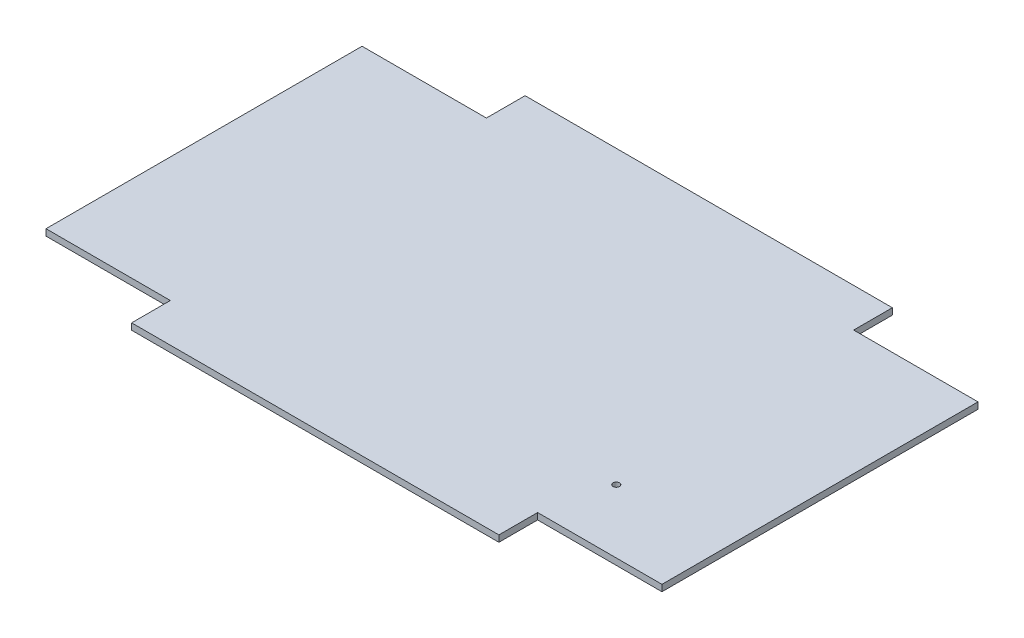
ISO-10303-21;
HEADER;
FILE_DESCRIPTION(('STEP AP214'),'2;1');
FILE_NAME('part.step','',(''),(''),'','','');
FILE_SCHEMA(('AUTOMOTIVE_DESIGN { 1 0 10303 214 1 1 1 1 }'));
ENDSEC;
DATA;
#1=APPLICATION_CONTEXT('core data for automotive mechanical design processes');
#2=APPLICATION_PROTOCOL_DEFINITION('international standard','automotive_design',2000,#1);
#3=PRODUCT_CONTEXT('',#1,'mechanical');
#4=PRODUCT('Part','Part','',(#3));
#5=PRODUCT_RELATED_PRODUCT_CATEGORY('part','',(#4));
#6=PRODUCT_DEFINITION_FORMATION('','',#4);
#7=PRODUCT_DEFINITION_CONTEXT('part definition',#1,'design');
#8=PRODUCT_DEFINITION('design','',#6,#7);
#9=PRODUCT_DEFINITION_SHAPE('','',#8);
#10=(LENGTH_UNIT() NAMED_UNIT(*) SI_UNIT(.MILLI.,.METRE.));
#11=(NAMED_UNIT(*) PLANE_ANGLE_UNIT() SI_UNIT($,.RADIAN.));
#12=(NAMED_UNIT(*) SI_UNIT($,.STERADIAN.) SOLID_ANGLE_UNIT());
#13=UNCERTAINTY_MEASURE_WITH_UNIT(LENGTH_MEASURE(1.E-05),#10,'distance_accuracy_value','');
#14=(GEOMETRIC_REPRESENTATION_CONTEXT(3) GLOBAL_UNCERTAINTY_ASSIGNED_CONTEXT((#13)) GLOBAL_UNIT_ASSIGNED_CONTEXT((#10,
#11,#12)) REPRESENTATION_CONTEXT('',''));
#15=CARTESIAN_POINT('',(0.,0.,0.));
#16=DIRECTION('',(0.,0.,1.));
#17=DIRECTION('',(1.,0.,0.));
#18=AXIS2_PLACEMENT_3D('',#15,#16,#17);
#19=CARTESIAN_POINT('',(0.,6.35,-311.15));
#20=DIRECTION('',(0.,0.,1.));
#21=DIRECTION('',(1.,0.,0.));
#22=AXIS2_PLACEMENT_3D('',#19,#20,#21);
#23=PLANE('',#22);
#24=DIRECTION('',(-1.,0.,0.));
#25=VECTOR('',#24,1.);
#26=CARTESIAN_POINT('',(0.,0.,-311.15));
#27=LINE('',#26,#25);
#28=CARTESIAN_POINT('',(122.428,0.,-311.15));
#29=VERTEX_POINT('',#28);
#30=CARTESIAN_POINT('',(0.,0.,-311.15));
#31=VERTEX_POINT('',#30);
#32=EDGE_CURVE('E163',#29,#31,#27,.T.);
#33=ORIENTED_EDGE('',*,*,#32,.T.);
#34=DIRECTION('',(0.,-1.,0.));
#35=VECTOR('',#34,1.);
#36=CARTESIAN_POINT('',(0.,6.35,-311.15));
#37=LINE('',#36,#35);
#38=CARTESIAN_POINT('',(0.,6.35,-311.15));
#39=VERTEX_POINT('',#38);
#40=EDGE_CURVE('E11',#39,#31,#37,.T.);
#41=ORIENTED_EDGE('',*,*,#40,.F.);
#42=DIRECTION('',(-1.,0.,0.));
#43=VECTOR('',#42,1.);
#44=CARTESIAN_POINT('',(0.,6.35,-311.15));
#45=LINE('',#44,#43);
#46=CARTESIAN_POINT('',(122.428,6.35,-311.15));
#47=VERTEX_POINT('',#46);
#48=EDGE_CURVE('E189',#47,#39,#45,.T.);
#49=ORIENTED_EDGE('',*,*,#48,.F.);
#50=DIRECTION('',(0.,-1.,0.));
#51=VECTOR('',#50,1.);
#52=CARTESIAN_POINT('',(122.428,6.35,-311.15));
#53=LINE('',#52,#51);
#54=EDGE_CURVE('E159',#47,#29,#53,.T.);
#55=ORIENTED_EDGE('',*,*,#54,.T.);
#56=EDGE_LOOP('',(#33,#41,#49,#55));
#57=FACE_BOUND('',#56,.T.);
#58=ADVANCED_FACE('F40',(#57),#23,.F.);
#59=CARTESIAN_POINT('',(0.,6.35,-311.15));
#60=DIRECTION('',(1.,0.,0.));
#61=DIRECTION('',(0.,0.,-1.));
#62=AXIS2_PLACEMENT_3D('',#59,#60,#61);
#63=PLANE('',#62);
#64=DIRECTION('',(0.,0.,1.));
#65=VECTOR('',#64,1.);
#66=CARTESIAN_POINT('',(0.,0.,-311.15));
#67=LINE('',#66,#65);
#68=CARTESIAN_POINT('',(0.,0.,0.));
#69=VERTEX_POINT('',#68);
#70=EDGE_CURVE('E166',#31,#69,#67,.T.);
#71=ORIENTED_EDGE('',*,*,#70,.T.);
#72=DIRECTION('',(0.,-1.,0.));
#73=VECTOR('',#72,1.);
#74=CARTESIAN_POINT('',(0.,6.35,0.));
#75=LINE('',#74,#73);
#76=CARTESIAN_POINT('',(0.,6.35,0.));
#77=VERTEX_POINT('',#76);
#78=EDGE_CURVE('E48',#77,#69,#75,.T.);
#79=ORIENTED_EDGE('',*,*,#78,.F.);
#80=DIRECTION('',(0.,0.,1.));
#81=VECTOR('',#80,1.);
#82=CARTESIAN_POINT('',(0.,6.35,-311.15));
#83=LINE('',#82,#81);
#84=EDGE_CURVE('E113',#39,#77,#83,.T.);
#85=ORIENTED_EDGE('',*,*,#84,.F.);
#86=ORIENTED_EDGE('',*,*,#40,.T.);
#87=EDGE_LOOP('',(#71,#79,#85,#86));
#88=FACE_BOUND('',#87,.T.);
#89=ADVANCED_FACE('F273',(#88),#63,.F.);
#90=CARTESIAN_POINT('',(122.428,6.35,0.));
#91=DIRECTION('',(0.,0.,-1.));
#92=DIRECTION('',(-1.,0.,0.));
#93=AXIS2_PLACEMENT_3D('',#90,#91,#92);
#94=PLANE('',#93);
#95=DIRECTION('',(1.,0.,0.));
#96=VECTOR('',#95,1.);
#97=CARTESIAN_POINT('',(122.428,0.,0.));
#98=LINE('',#97,#96);
#99=CARTESIAN_POINT('',(122.428,0.,0.));
#100=VERTEX_POINT('',#99);
#101=EDGE_CURVE('E169',#69,#100,#98,.T.);
#102=ORIENTED_EDGE('',*,*,#101,.T.);
#103=DIRECTION('',(0.,-1.,0.));
#104=VECTOR('',#103,1.);
#105=CARTESIAN_POINT('',(122.428,6.35,0.));
#106=LINE('',#105,#104);
#107=CARTESIAN_POINT('',(122.428,6.35,0.));
#108=VERTEX_POINT('',#107);
#109=EDGE_CURVE('E210',#108,#100,#106,.T.);
#110=ORIENTED_EDGE('',*,*,#109,.F.);
#111=DIRECTION('',(1.,0.,0.));
#112=VECTOR('',#111,1.);
#113=CARTESIAN_POINT('',(122.428,6.35,0.));
#114=LINE('',#113,#112);
#115=EDGE_CURVE('E218',#77,#108,#114,.T.);
#116=ORIENTED_EDGE('',*,*,#115,.F.);
#117=ORIENTED_EDGE('',*,*,#78,.T.);
#118=EDGE_LOOP('',(#102,#110,#116,#117));
#119=FACE_BOUND('',#118,.T.);
#120=ADVANCED_FACE('F216',(#119),#94,.F.);
#121=CARTESIAN_POINT('',(122.428,6.35,0.));
#122=DIRECTION('',(1.,0.,0.));
#123=DIRECTION('',(0.,0.,-1.));
#124=AXIS2_PLACEMENT_3D('',#121,#122,#123);
#125=PLANE('',#124);
#126=DIRECTION('',(0.,0.,1.));
#127=VECTOR('',#126,1.);
#128=CARTESIAN_POINT('',(122.428,0.,0.));
#129=LINE('',#128,#127);
#130=CARTESIAN_POINT('',(122.428,0.,38.1));
#131=VERTEX_POINT('',#130);
#132=EDGE_CURVE('E171',#100,#131,#129,.T.);
#133=ORIENTED_EDGE('',*,*,#132,.T.);
#134=DIRECTION('',(0.,-1.,0.));
#135=VECTOR('',#134,1.);
#136=CARTESIAN_POINT('',(122.428,6.35,38.1));
#137=LINE('',#136,#135);
#138=CARTESIAN_POINT('',(122.428,6.35,38.1));
#139=VERTEX_POINT('',#138);
#140=EDGE_CURVE('E207',#139,#131,#137,.T.);
#141=ORIENTED_EDGE('',*,*,#140,.F.);
#142=DIRECTION('',(0.,0.,1.));
#143=VECTOR('',#142,1.);
#144=CARTESIAN_POINT('',(122.428,6.35,0.));
#145=LINE('',#144,#143);
#146=EDGE_CURVE('E237',#108,#139,#145,.T.);
#147=ORIENTED_EDGE('',*,*,#146,.F.);
#148=ORIENTED_EDGE('',*,*,#109,.T.);
#149=EDGE_LOOP('',(#133,#141,#147,#148));
#150=FACE_BOUND('',#149,.T.);
#151=ADVANCED_FACE('F227',(#150),#125,.F.);
#152=CARTESIAN_POINT('',(122.428,6.35,38.1));
#153=DIRECTION('',(0.,0.,-1.));
#154=DIRECTION('',(-1.,0.,0.));
#155=AXIS2_PLACEMENT_3D('',#152,#153,#154);
#156=PLANE('',#155);
#157=DIRECTION('',(1.,0.,0.));
#158=VECTOR('',#157,1.);
#159=CARTESIAN_POINT('',(122.428,0.,38.1));
#160=LINE('',#159,#158);
#161=CARTESIAN_POINT('',(483.997,0.,38.1));
#162=VERTEX_POINT('',#161);
#163=EDGE_CURVE('E173',#131,#162,#160,.T.);
#164=ORIENTED_EDGE('',*,*,#163,.T.);
#165=DIRECTION('',(0.,-1.,0.));
#166=VECTOR('',#165,1.);
#167=CARTESIAN_POINT('',(483.997,6.35,38.1));
#168=LINE('',#167,#166);
#169=CARTESIAN_POINT('',(483.997,6.35,38.1));
#170=VERTEX_POINT('',#169);
#171=EDGE_CURVE('E203',#170,#162,#168,.T.);
#172=ORIENTED_EDGE('',*,*,#171,.F.);
#173=DIRECTION('',(1.,0.,0.));
#174=VECTOR('',#173,1.);
#175=CARTESIAN_POINT('',(122.428,6.35,38.1));
#176=LINE('',#175,#174);
#177=EDGE_CURVE('E233',#139,#170,#176,.T.);
#178=ORIENTED_EDGE('',*,*,#177,.F.);
#179=ORIENTED_EDGE('',*,*,#140,.T.);
#180=EDGE_LOOP('',(#164,#172,#178,#179));
#181=FACE_BOUND('',#180,.T.);
#182=ADVANCED_FACE('F231',(#181),#156,.F.);
#183=CARTESIAN_POINT('',(483.997,6.35,38.1));
#184=DIRECTION('',(-1.,0.,0.));
#185=DIRECTION('',(0.,0.,1.));
#186=AXIS2_PLACEMENT_3D('',#183,#184,#185);
#187=PLANE('',#186);
#188=DIRECTION('',(0.,0.,-1.));
#189=VECTOR('',#188,1.);
#190=CARTESIAN_POINT('',(483.997,0.,38.1));
#191=LINE('',#190,#189);
#192=CARTESIAN_POINT('',(483.997,0.,0.));
#193=VERTEX_POINT('',#192);
#194=EDGE_CURVE('E176',#162,#193,#191,.T.);
#195=ORIENTED_EDGE('',*,*,#194,.T.);
#196=DIRECTION('',(0.,-1.,0.));
#197=VECTOR('',#196,1.);
#198=CARTESIAN_POINT('',(483.997,6.35,0.));
#199=LINE('',#198,#197);
#200=CARTESIAN_POINT('',(483.997,6.35,0.));
#201=VERTEX_POINT('',#200);
#202=EDGE_CURVE('E199',#201,#193,#199,.T.);
#203=ORIENTED_EDGE('',*,*,#202,.F.);
#204=DIRECTION('',(0.,0.,-1.));
#205=VECTOR('',#204,1.);
#206=CARTESIAN_POINT('',(483.997,6.35,38.1));
#207=LINE('',#206,#205);
#208=EDGE_CURVE('E236',#170,#201,#207,.T.);
#209=ORIENTED_EDGE('',*,*,#208,.F.);
#210=ORIENTED_EDGE('',*,*,#171,.T.);
#211=EDGE_LOOP('',(#195,#203,#209,#210));
#212=FACE_BOUND('',#211,.T.);
#213=ADVANCED_FACE('F286',(#212),#187,.F.);
#214=CARTESIAN_POINT('',(606.425,6.35,0.));
#215=DIRECTION('',(0.,0.,-1.));
#216=DIRECTION('',(-1.,0.,0.));
#217=AXIS2_PLACEMENT_3D('',#214,#215,#216);
#218=PLANE('',#217);
#219=DIRECTION('',(1.,0.,0.));
#220=VECTOR('',#219,1.);
#221=CARTESIAN_POINT('',(606.425,0.,0.));
#222=LINE('',#221,#220);
#223=CARTESIAN_POINT('',(606.425,0.,0.));
#224=VERTEX_POINT('',#223);
#225=EDGE_CURVE('E179',#193,#224,#222,.T.);
#226=ORIENTED_EDGE('',*,*,#225,.T.);
#227=DIRECTION('',(0.,-1.,0.));
#228=VECTOR('',#227,1.);
#229=CARTESIAN_POINT('',(606.425,6.35,0.));
#230=LINE('',#229,#228);
#231=CARTESIAN_POINT('',(606.425,6.35,0.));
#232=VERTEX_POINT('',#231);
#233=EDGE_CURVE('E196',#232,#224,#230,.T.);
#234=ORIENTED_EDGE('',*,*,#233,.F.);
#235=DIRECTION('',(1.,0.,0.));
#236=VECTOR('',#235,1.);
#237=CARTESIAN_POINT('',(606.425,6.35,0.));
#238=LINE('',#237,#236);
#239=EDGE_CURVE('E240',#201,#232,#238,.T.);
#240=ORIENTED_EDGE('',*,*,#239,.F.);
#241=ORIENTED_EDGE('',*,*,#202,.T.);
#242=EDGE_LOOP('',(#226,#234,#240,#241));
#243=FACE_BOUND('',#242,.T.);
#244=ADVANCED_FACE('F289',(#243),#218,.F.);
#245=CARTESIAN_POINT('',(606.425,6.35,-311.15));
#246=DIRECTION('',(-1.,0.,0.));
#247=DIRECTION('',(0.,0.,1.));
#248=AXIS2_PLACEMENT_3D('',#245,#246,#247);
#249=PLANE('',#248);
#250=DIRECTION('',(0.,0.,-1.));
#251=VECTOR('',#250,1.);
#252=CARTESIAN_POINT('',(606.425,0.,-311.15));
#253=LINE('',#252,#251);
#254=CARTESIAN_POINT('',(606.425,0.,-311.15));
#255=VERTEX_POINT('',#254);
#256=EDGE_CURVE('E182',#224,#255,#253,.T.);
#257=ORIENTED_EDGE('',*,*,#256,.T.);
#258=DIRECTION('',(0.,-1.,0.));
#259=VECTOR('',#258,1.);
#260=CARTESIAN_POINT('',(606.425,6.35,-311.15));
#261=LINE('',#260,#259);
#262=CARTESIAN_POINT('',(606.425,6.35,-311.15));
#263=VERTEX_POINT('',#262);
#264=EDGE_CURVE('E193',#263,#255,#261,.T.);
#265=ORIENTED_EDGE('',*,*,#264,.F.);
#266=DIRECTION('',(0.,0.,-1.));
#267=VECTOR('',#266,1.);
#268=CARTESIAN_POINT('',(606.425,6.35,-311.15));
#269=LINE('',#268,#267);
#270=EDGE_CURVE('E246',#232,#263,#269,.T.);
#271=ORIENTED_EDGE('',*,*,#270,.F.);
#272=ORIENTED_EDGE('',*,*,#233,.T.);
#273=EDGE_LOOP('',(#257,#265,#271,#272));
#274=FACE_BOUND('',#273,.T.);
#275=ADVANCED_FACE('F252',(#274),#249,.F.);
#276=CARTESIAN_POINT('',(483.997,6.35,-311.15));
#277=DIRECTION('',(0.,0.,1.));
#278=DIRECTION('',(1.,0.,0.));
#279=AXIS2_PLACEMENT_3D('',#276,#277,#278);
#280=PLANE('',#279);
#281=DIRECTION('',(-1.,0.,0.));
#282=VECTOR('',#281,1.);
#283=CARTESIAN_POINT('',(483.997,0.,-311.15));
#284=LINE('',#283,#282);
#285=CARTESIAN_POINT('',(483.997,0.,-311.15));
#286=VERTEX_POINT('',#285);
#287=EDGE_CURVE('E184',#255,#286,#284,.T.);
#288=ORIENTED_EDGE('',*,*,#287,.T.);
#289=DIRECTION('',(0.,-1.,0.));
#290=VECTOR('',#289,1.);
#291=CARTESIAN_POINT('',(483.997,6.35,-311.15));
#292=LINE('',#291,#290);
#293=CARTESIAN_POINT('',(483.997,6.35,-311.15));
#294=VERTEX_POINT('',#293);
#295=EDGE_CURVE('E154',#294,#286,#292,.T.);
#296=ORIENTED_EDGE('',*,*,#295,.F.);
#297=DIRECTION('',(-1.,0.,0.));
#298=VECTOR('',#297,1.);
#299=CARTESIAN_POINT('',(483.997,6.35,-311.15));
#300=LINE('',#299,#298);
#301=EDGE_CURVE('E145',#263,#294,#300,.T.);
#302=ORIENTED_EDGE('',*,*,#301,.F.);
#303=ORIENTED_EDGE('',*,*,#264,.T.);
#304=EDGE_LOOP('',(#288,#296,#302,#303));
#305=FACE_BOUND('',#304,.T.);
#306=ADVANCED_FACE('F256',(#305),#280,.F.);
#307=CARTESIAN_POINT('',(483.997,6.35,-349.25));
#308=DIRECTION('',(-1.,0.,0.));
#309=DIRECTION('',(0.,0.,1.));
#310=AXIS2_PLACEMENT_3D('',#307,#308,#309);
#311=PLANE('',#310);
#312=DIRECTION('',(0.,0.,-1.));
#313=VECTOR('',#312,1.);
#314=CARTESIAN_POINT('',(483.997,0.,-349.25));
#315=LINE('',#314,#313);
#316=CARTESIAN_POINT('',(483.997,0.,-349.25));
#317=VERTEX_POINT('',#316);
#318=EDGE_CURVE('E153',#286,#317,#315,.T.);
#319=ORIENTED_EDGE('',*,*,#318,.T.);
#320=DIRECTION('',(0.,-1.,0.));
#321=VECTOR('',#320,1.);
#322=CARTESIAN_POINT('',(483.997,6.35,-349.25));
#323=LINE('',#322,#321);
#324=CARTESIAN_POINT('',(483.997,6.35,-349.25));
#325=VERTEX_POINT('',#324);
#326=EDGE_CURVE('E150',#325,#317,#323,.T.);
#327=ORIENTED_EDGE('',*,*,#326,.F.);
#328=DIRECTION('',(0.,0.,-1.));
#329=VECTOR('',#328,1.);
#330=CARTESIAN_POINT('',(483.997,6.35,-349.25));
#331=LINE('',#330,#329);
#332=EDGE_CURVE('E139',#294,#325,#331,.T.);
#333=ORIENTED_EDGE('',*,*,#332,.F.);
#334=ORIENTED_EDGE('',*,*,#295,.T.);
#335=EDGE_LOOP('',(#319,#327,#333,#334));
#336=FACE_BOUND('',#335,.T.);
#337=ADVANCED_FACE('F151',(#336),#311,.F.);
#338=CARTESIAN_POINT('',(122.428,6.35,-349.25));
#339=DIRECTION('',(0.,0.,1.));
#340=DIRECTION('',(1.,0.,0.));
#341=AXIS2_PLACEMENT_3D('',#338,#339,#340);
#342=PLANE('',#341);
#343=DIRECTION('',(-1.,0.,0.));
#344=VECTOR('',#343,1.);
#345=CARTESIAN_POINT('',(122.428,0.,-349.25));
#346=LINE('',#345,#344);
#347=CARTESIAN_POINT('',(122.428,0.,-349.25));
#348=VERTEX_POINT('',#347);
#349=EDGE_CURVE('E99',#317,#348,#346,.T.);
#350=ORIENTED_EDGE('',*,*,#349,.T.);
#351=DIRECTION('',(0.,-1.,0.));
#352=VECTOR('',#351,1.);
#353=CARTESIAN_POINT('',(122.428,6.35,-349.25));
#354=LINE('',#353,#352);
#355=CARTESIAN_POINT('',(122.428,6.35,-349.25));
#356=VERTEX_POINT('',#355);
#357=EDGE_CURVE('E155',#356,#348,#354,.T.);
#358=ORIENTED_EDGE('',*,*,#357,.F.);
#359=DIRECTION('',(-1.,0.,0.));
#360=VECTOR('',#359,1.);
#361=CARTESIAN_POINT('',(122.428,6.35,-349.25));
#362=LINE('',#361,#360);
#363=EDGE_CURVE('E143',#325,#356,#362,.T.);
#364=ORIENTED_EDGE('',*,*,#363,.F.);
#365=ORIENTED_EDGE('',*,*,#326,.T.);
#366=EDGE_LOOP('',(#350,#358,#364,#365));
#367=FACE_BOUND('',#366,.T.);
#368=ADVANCED_FACE('F157',(#367),#342,.F.);
#369=CARTESIAN_POINT('',(122.428,6.35,-311.15));
#370=DIRECTION('',(1.,0.,0.));
#371=DIRECTION('',(0.,0.,-1.));
#372=AXIS2_PLACEMENT_3D('',#369,#370,#371);
#373=PLANE('',#372);
#374=DIRECTION('',(0.,0.,1.));
#375=VECTOR('',#374,1.);
#376=CARTESIAN_POINT('',(122.428,0.,-311.15));
#377=LINE('',#376,#375);
#378=EDGE_CURVE('E105',#348,#29,#377,.T.);
#379=ORIENTED_EDGE('',*,*,#378,.T.);
#380=ORIENTED_EDGE('',*,*,#54,.F.);
#381=DIRECTION('',(0.,0.,1.));
#382=VECTOR('',#381,1.);
#383=CARTESIAN_POINT('',(122.428,6.35,-311.15));
#384=LINE('',#383,#382);
#385=EDGE_CURVE('E56',#356,#47,#384,.T.);
#386=ORIENTED_EDGE('',*,*,#385,.F.);
#387=ORIENTED_EDGE('',*,*,#357,.T.);
#388=EDGE_LOOP('',(#379,#380,#386,#387));
#389=FACE_BOUND('',#388,.T.);
#390=ADVANCED_FACE('F260',(#389),#373,.F.);
#391=CARTESIAN_POINT('',(0.,6.35,0.));
#392=DIRECTION('',(0.,1.,0.));
#393=DIRECTION('',(0.,0.,1.));
#394=AXIS2_PLACEMENT_3D('',#391,#392,#393);
#395=PLANE('',#394);
#396=CARTESIAN_POINT('',(498.983,6.35,-62.484));
#397=DIRECTION('',(0.,1.,0.));
#398=DIRECTION('',(0.,0.,1.));
#399=AXIS2_PLACEMENT_3D('',#396,#397,#398);
#400=CIRCLE('',#399,3.17500000000008);
#401=CARTESIAN_POINT('',(498.983,6.35,-59.3089999999999));
#402=VERTEX_POINT('',#401);
#403=EDGE_CURVE('E346',#402,#402,#400,.T.);
#404=ORIENTED_EDGE('',*,*,#403,.F.);
#405=EDGE_LOOP('',(#404));
#406=FACE_BOUND('',#405,.T.);
#407=ORIENTED_EDGE('',*,*,#48,.T.);
#408=ORIENTED_EDGE('',*,*,#84,.T.);
#409=ORIENTED_EDGE('',*,*,#115,.T.);
#410=ORIENTED_EDGE('',*,*,#146,.T.);
#411=ORIENTED_EDGE('',*,*,#177,.T.);
#412=ORIENTED_EDGE('',*,*,#208,.T.);
#413=ORIENTED_EDGE('',*,*,#239,.T.);
#414=ORIENTED_EDGE('',*,*,#270,.T.);
#415=ORIENTED_EDGE('',*,*,#301,.T.);
#416=ORIENTED_EDGE('',*,*,#332,.T.);
#417=ORIENTED_EDGE('',*,*,#363,.T.);
#418=ORIENTED_EDGE('',*,*,#385,.T.);
#419=EDGE_LOOP('',(#407,#408,#409,#410,#411,#412,#413,#414,#415,#416,#417,#418));
#420=FACE_BOUND('',#419,.T.);
#421=ADVANCED_FACE('F141',(#406,#420),#395,.T.);
#422=CARTESIAN_POINT('',(0.,0.,0.));
#423=DIRECTION('',(0.,1.,0.));
#424=DIRECTION('',(0.,0.,1.));
#425=AXIS2_PLACEMENT_3D('',#422,#423,#424);
#426=PLANE('',#425);
#427=CARTESIAN_POINT('',(498.983,0.,-62.484));
#428=DIRECTION('',(0.,1.,0.));
#429=DIRECTION('',(0.,0.,1.));
#430=AXIS2_PLACEMENT_3D('',#427,#428,#429);
#431=CIRCLE('',#430,3.17500000000008);
#432=CARTESIAN_POINT('',(498.983,0.,-59.3089999999999));
#433=VERTEX_POINT('',#432);
#434=EDGE_CURVE('E167',#433,#433,#431,.T.);
#435=ORIENTED_EDGE('',*,*,#434,.T.);
#436=EDGE_LOOP('',(#435));
#437=FACE_BOUND('',#436,.T.);
#438=ORIENTED_EDGE('',*,*,#32,.F.);
#439=ORIENTED_EDGE('',*,*,#378,.F.);
#440=ORIENTED_EDGE('',*,*,#349,.F.);
#441=ORIENTED_EDGE('',*,*,#318,.F.);
#442=ORIENTED_EDGE('',*,*,#287,.F.);
#443=ORIENTED_EDGE('',*,*,#256,.F.);
#444=ORIENTED_EDGE('',*,*,#225,.F.);
#445=ORIENTED_EDGE('',*,*,#194,.F.);
#446=ORIENTED_EDGE('',*,*,#163,.F.);
#447=ORIENTED_EDGE('',*,*,#132,.F.);
#448=ORIENTED_EDGE('',*,*,#101,.F.);
#449=ORIENTED_EDGE('',*,*,#70,.F.);
#450=EDGE_LOOP('',(#438,#439,#440,#441,#442,#443,#444,#445,#446,#447,#448,#449));
#451=FACE_BOUND('',#450,.T.);
#452=ADVANCED_FACE('F222',(#437,#451),#426,.F.);
#453=CARTESIAN_POINT('',(498.983,0.,-62.484));
#454=DIRECTION('',(0.,1.,0.));
#455=DIRECTION('',(0.,0.,1.));
#456=AXIS2_PLACEMENT_3D('',#453,#454,#455);
#457=CYLINDRICAL_SURFACE('',#456,3.17500000000008);
#458=ORIENTED_EDGE('',*,*,#434,.F.);
#459=EDGE_LOOP('',(#458));
#460=FACE_BOUND('',#459,.T.);
#461=ORIENTED_EDGE('',*,*,#403,.T.);
#462=EDGE_LOOP('',(#461));
#463=FACE_BOUND('',#462,.T.);
#464=ADVANCED_FACE('F328',(#460,#463),#457,.F.);
#465=CLOSED_SHELL('',(#58,#89,#120,#151,#182,#213,#244,#275,#306,#337,#368,#390,#421,#452,#464));
#466=MANIFOLD_SOLID_BREP('B2',#465);
#467=ADVANCED_BREP_SHAPE_REPRESENTATION('',(#18,#466),#14);
#468=SHAPE_DEFINITION_REPRESENTATION(#9,#467);
ENDSEC;
END-ISO-10303-21;
